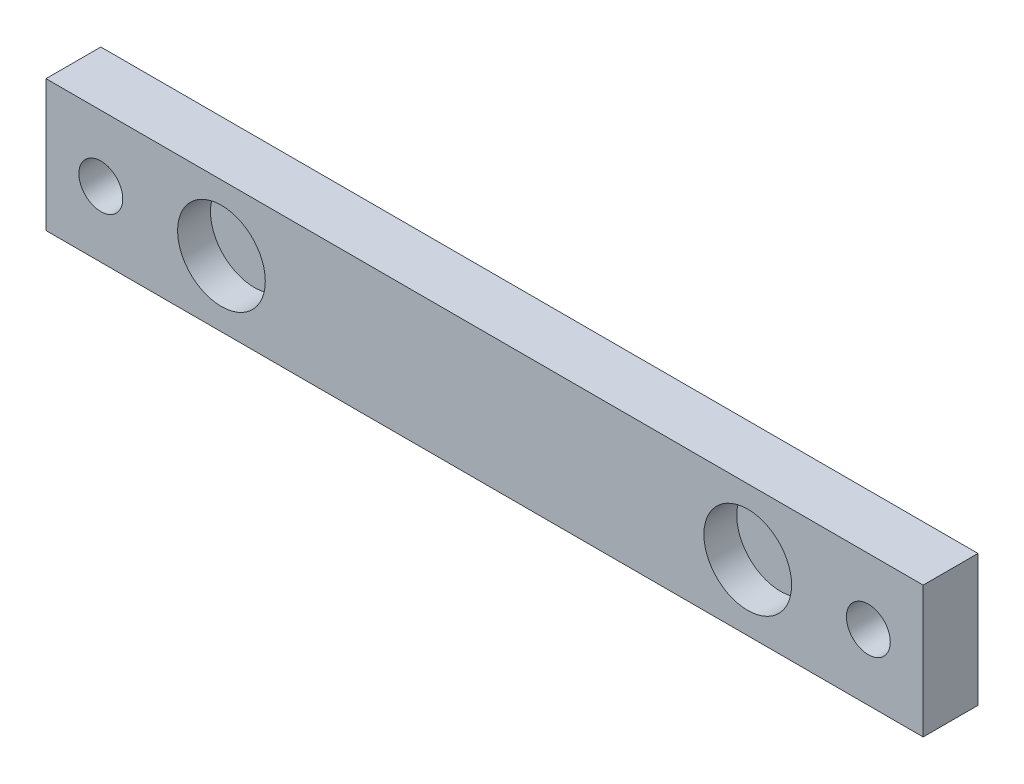
ISO-10303-21;
HEADER;
FILE_DESCRIPTION(('STEP AP214'),'2;1');
FILE_NAME('part.step','',(''),(''),'','','');
FILE_SCHEMA(('AUTOMOTIVE_DESIGN { 1 0 10303 214 1 1 1 1 }'));
ENDSEC;
DATA;
#1=APPLICATION_CONTEXT('core data for automotive mechanical design processes');
#2=APPLICATION_PROTOCOL_DEFINITION('international standard','automotive_design',2000,#1);
#3=PRODUCT_CONTEXT('',#1,'mechanical');
#4=PRODUCT('Part','Part','',(#3));
#5=PRODUCT_RELATED_PRODUCT_CATEGORY('part','',(#4));
#6=PRODUCT_DEFINITION_FORMATION('','',#4);
#7=PRODUCT_DEFINITION_CONTEXT('part definition',#1,'design');
#8=PRODUCT_DEFINITION('design','',#6,#7);
#9=PRODUCT_DEFINITION_SHAPE('','',#8);
#10=(LENGTH_UNIT() NAMED_UNIT(*) SI_UNIT(.MILLI.,.METRE.));
#11=(NAMED_UNIT(*) PLANE_ANGLE_UNIT() SI_UNIT($,.RADIAN.));
#12=(NAMED_UNIT(*) SI_UNIT($,.STERADIAN.) SOLID_ANGLE_UNIT());
#13=UNCERTAINTY_MEASURE_WITH_UNIT(LENGTH_MEASURE(1.E-05),#10,'distance_accuracy_value','');
#14=(GEOMETRIC_REPRESENTATION_CONTEXT(3) GLOBAL_UNCERTAINTY_ASSIGNED_CONTEXT((#13)) GLOBAL_UNIT_ASSIGNED_CONTEXT((#10,
#11,#12)) REPRESENTATION_CONTEXT('',''));
#15=CARTESIAN_POINT('',(0.,0.,0.));
#16=DIRECTION('',(0.,0.,1.));
#17=DIRECTION('',(1.,0.,0.));
#18=AXIS2_PLACEMENT_3D('',#15,#16,#17);
#19=CARTESIAN_POINT('',(14.,0.,5.));
#20=DIRECTION('',(0.,0.,-1.));
#21=DIRECTION('',(-1.,0.,0.));
#22=AXIS2_PLACEMENT_3D('',#19,#20,#21);
#23=CYLINDRICAL_SURFACE('',#22,4.);
#24=CARTESIAN_POINT('',(14.,0.,5.));
#25=DIRECTION('',(0.,0.,1.));
#26=DIRECTION('',(1.,0.,0.));
#27=AXIS2_PLACEMENT_3D('',#24,#25,#26);
#28=CIRCLE('',#27,4.);
#29=CARTESIAN_POINT('',(18.,0.,5.));
#30=VERTEX_POINT('',#29);
#31=EDGE_CURVE('E126',#30,#30,#28,.T.);
#32=ORIENTED_EDGE('',*,*,#31,.T.);
#33=EDGE_LOOP('',(#32));
#34=FACE_BOUND('',#33,.T.);
#35=CARTESIAN_POINT('',(14.,0.,2.));
#36=DIRECTION('',(0.,0.,-1.));
#37=DIRECTION('',(-1.,0.,0.));
#38=AXIS2_PLACEMENT_3D('',#35,#36,#37);
#39=CIRCLE('',#38,4.);
#40=CARTESIAN_POINT('',(10.,0.,2.));
#41=VERTEX_POINT('',#40);
#42=EDGE_CURVE('E132',#41,#41,#39,.T.);
#43=ORIENTED_EDGE('',*,*,#42,.T.);
#44=EDGE_LOOP('',(#43));
#45=FACE_BOUND('',#44,.T.);
#46=ADVANCED_FACE('F32',(#34,#45),#23,.F.);
#47=CARTESIAN_POINT('',(-34.,0.,5.));
#48=DIRECTION('',(0.,0.,-1.));
#49=DIRECTION('',(-1.,0.,0.));
#50=AXIS2_PLACEMENT_3D('',#47,#48,#49);
#51=CYLINDRICAL_SURFACE('',#50,3.99999999999999);
#52=CARTESIAN_POINT('',(-34.,0.,5.));
#53=DIRECTION('',(0.,0.,1.));
#54=DIRECTION('',(1.,0.,0.));
#55=AXIS2_PLACEMENT_3D('',#52,#53,#54);
#56=CIRCLE('',#55,3.99999999999999);
#57=CARTESIAN_POINT('',(-30.,0.,5.));
#58=VERTEX_POINT('',#57);
#59=EDGE_CURVE('E121',#58,#58,#56,.T.);
#60=ORIENTED_EDGE('',*,*,#59,.T.);
#61=EDGE_LOOP('',(#60));
#62=FACE_BOUND('',#61,.T.);
#63=CARTESIAN_POINT('',(-34.,0.,2.));
#64=DIRECTION('',(0.,0.,-1.));
#65=DIRECTION('',(-1.,0.,0.));
#66=AXIS2_PLACEMENT_3D('',#63,#64,#65);
#67=CIRCLE('',#66,4.);
#68=CARTESIAN_POINT('',(-38.,0.,2.));
#69=VERTEX_POINT('',#68);
#70=EDGE_CURVE('E129',#69,#69,#67,.T.);
#71=ORIENTED_EDGE('',*,*,#70,.T.);
#72=EDGE_LOOP('',(#71));
#73=FACE_BOUND('',#72,.T.);
#74=ADVANCED_FACE('F148',(#62,#73),#51,.F.);
#75=CARTESIAN_POINT('',(0.,0.,5.));
#76=DIRECTION('',(0.,0.,1.));
#77=DIRECTION('',(1.,0.,0.));
#78=AXIS2_PLACEMENT_3D('',#75,#76,#77);
#79=PLANE('',#78);
#80=ORIENTED_EDGE('',*,*,#59,.F.);
#81=EDGE_LOOP('',(#80));
#82=FACE_BOUND('',#81,.T.);
#83=CARTESIAN_POINT('',(-45.,0.,5.));
#84=DIRECTION('',(0.,0.,1.));
#85=DIRECTION('',(1.,0.,0.));
#86=AXIS2_PLACEMENT_3D('',#83,#84,#85);
#87=CIRCLE('',#86,2.);
#88=CARTESIAN_POINT('',(-43.,0.,5.));
#89=VERTEX_POINT('',#88);
#90=EDGE_CURVE('E100',#89,#89,#87,.T.);
#91=ORIENTED_EDGE('',*,*,#90,.F.);
#92=EDGE_LOOP('',(#91));
#93=FACE_BOUND('',#92,.T.);
#94=DIRECTION('',(-1.,0.,0.));
#95=VECTOR('',#94,1.);
#96=CARTESIAN_POINT('',(30.,6.,5.));
#97=LINE('',#96,#95);
#98=CARTESIAN_POINT('',(30.,6.,5.));
#99=VERTEX_POINT('',#98);
#100=CARTESIAN_POINT('',(-50.,5.99999999999999,5.));
#101=VERTEX_POINT('',#100);
#102=EDGE_CURVE('E85',#99,#101,#97,.T.);
#103=ORIENTED_EDGE('',*,*,#102,.T.);
#104=DIRECTION('',(0.,-1.,0.));
#105=VECTOR('',#104,1.);
#106=CARTESIAN_POINT('',(-50.,5.99999999999999,5.));
#107=LINE('',#106,#105);
#108=CARTESIAN_POINT('',(-50.,-6.00000000000001,5.));
#109=VERTEX_POINT('',#108);
#110=EDGE_CURVE('E79',#101,#109,#107,.T.);
#111=ORIENTED_EDGE('',*,*,#110,.T.);
#112=DIRECTION('',(1.,0.,0.));
#113=VECTOR('',#112,1.);
#114=CARTESIAN_POINT('',(-50.,-6.00000000000001,5.));
#115=LINE('',#114,#113);
#116=CARTESIAN_POINT('',(30.,-6.,5.));
#117=VERTEX_POINT('',#116);
#118=EDGE_CURVE('E83',#109,#117,#115,.T.);
#119=ORIENTED_EDGE('',*,*,#118,.T.);
#120=DIRECTION('',(0.,1.,0.));
#121=VECTOR('',#120,1.);
#122=CARTESIAN_POINT('',(30.,-6.,5.));
#123=LINE('',#122,#121);
#124=EDGE_CURVE('E49',#117,#99,#123,.T.);
#125=ORIENTED_EDGE('',*,*,#124,.T.);
#126=EDGE_LOOP('',(#103,#111,#119,#125));
#127=FACE_BOUND('',#126,.T.);
#128=CARTESIAN_POINT('',(25.,0.,5.));
#129=DIRECTION('',(0.,0.,1.));
#130=DIRECTION('',(1.,0.,0.));
#131=AXIS2_PLACEMENT_3D('',#128,#129,#130);
#132=CIRCLE('',#131,2.);
#133=CARTESIAN_POINT('',(27.,0.,5.));
#134=VERTEX_POINT('',#133);
#135=EDGE_CURVE('E115',#134,#134,#132,.T.);
#136=ORIENTED_EDGE('',*,*,#135,.F.);
#137=EDGE_LOOP('',(#136));
#138=FACE_BOUND('',#137,.T.);
#139=ORIENTED_EDGE('',*,*,#31,.F.);
#140=EDGE_LOOP('',(#139));
#141=FACE_BOUND('',#140,.T.);
#142=ADVANCED_FACE('F80',(#82,#93,#127,#138,#141),#79,.T.);
#143=CARTESIAN_POINT('',(0.,0.,0.));
#144=DIRECTION('',(0.,0.,1.));
#145=DIRECTION('',(1.,0.,0.));
#146=AXIS2_PLACEMENT_3D('',#143,#144,#145);
#147=PLANE('',#146);
#148=DIRECTION('',(-1.,0.,0.));
#149=VECTOR('',#148,1.);
#150=CARTESIAN_POINT('',(30.,6.,0.));
#151=LINE('',#150,#149);
#152=CARTESIAN_POINT('',(30.,6.,0.));
#153=VERTEX_POINT('',#152);
#154=CARTESIAN_POINT('',(-50.,5.99999999999999,0.));
#155=VERTEX_POINT('',#154);
#156=EDGE_CURVE('E97',#153,#155,#151,.T.);
#157=ORIENTED_EDGE('',*,*,#156,.F.);
#158=DIRECTION('',(0.,1.,0.));
#159=VECTOR('',#158,1.);
#160=CARTESIAN_POINT('',(30.,-6.,0.));
#161=LINE('',#160,#159);
#162=CARTESIAN_POINT('',(30.,-6.,0.));
#163=VERTEX_POINT('',#162);
#164=EDGE_CURVE('E72',#163,#153,#161,.T.);
#165=ORIENTED_EDGE('',*,*,#164,.F.);
#166=DIRECTION('',(1.,0.,0.));
#167=VECTOR('',#166,1.);
#168=CARTESIAN_POINT('',(-50.,-6.00000000000001,0.));
#169=LINE('',#168,#167);
#170=CARTESIAN_POINT('',(-50.,-6.00000000000001,0.));
#171=VERTEX_POINT('',#170);
#172=EDGE_CURVE('E66',#171,#163,#169,.T.);
#173=ORIENTED_EDGE('',*,*,#172,.F.);
#174=DIRECTION('',(0.,-1.,0.));
#175=VECTOR('',#174,1.);
#176=CARTESIAN_POINT('',(-50.,5.99999999999999,0.));
#177=LINE('',#176,#175);
#178=EDGE_CURVE('E89',#155,#171,#177,.T.);
#179=ORIENTED_EDGE('',*,*,#178,.F.);
#180=EDGE_LOOP('',(#157,#165,#173,#179));
#181=FACE_BOUND('',#180,.T.);
#182=CARTESIAN_POINT('',(-45.,0.,0.));
#183=DIRECTION('',(0.,0.,1.));
#184=DIRECTION('',(1.,0.,0.));
#185=AXIS2_PLACEMENT_3D('',#182,#183,#184);
#186=CIRCLE('',#185,2.);
#187=CARTESIAN_POINT('',(-43.,0.,0.));
#188=VERTEX_POINT('',#187);
#189=EDGE_CURVE('E112',#188,#188,#186,.T.);
#190=ORIENTED_EDGE('',*,*,#189,.T.);
#191=EDGE_LOOP('',(#190));
#192=FACE_BOUND('',#191,.T.);
#193=CARTESIAN_POINT('',(25.,0.,0.));
#194=DIRECTION('',(0.,0.,1.));
#195=DIRECTION('',(1.,0.,0.));
#196=AXIS2_PLACEMENT_3D('',#193,#194,#195);
#197=CIRCLE('',#196,2.);
#198=CARTESIAN_POINT('',(27.,0.,0.));
#199=VERTEX_POINT('',#198);
#200=EDGE_CURVE('E118',#199,#199,#197,.T.);
#201=ORIENTED_EDGE('',*,*,#200,.T.);
#202=EDGE_LOOP('',(#201));
#203=FACE_BOUND('',#202,.T.);
#204=ADVANCED_FACE('F108',(#181,#192,#203),#147,.F.);
#205=CARTESIAN_POINT('',(30.,6.,5.));
#206=DIRECTION('',(0.,-1.,0.));
#207=DIRECTION('',(1.,0.,0.));
#208=AXIS2_PLACEMENT_3D('',#205,#206,#207);
#209=PLANE('',#208);
#210=ORIENTED_EDGE('',*,*,#156,.T.);
#211=DIRECTION('',(0.,0.,-1.));
#212=VECTOR('',#211,1.);
#213=CARTESIAN_POINT('',(-50.,5.99999999999999,5.));
#214=LINE('',#213,#212);
#215=EDGE_CURVE('E11',#101,#155,#214,.T.);
#216=ORIENTED_EDGE('',*,*,#215,.F.);
#217=ORIENTED_EDGE('',*,*,#102,.F.);
#218=DIRECTION('',(0.,0.,-1.));
#219=VECTOR('',#218,1.);
#220=CARTESIAN_POINT('',(30.,6.,5.));
#221=LINE('',#220,#219);
#222=EDGE_CURVE('E93',#99,#153,#221,.T.);
#223=ORIENTED_EDGE('',*,*,#222,.T.);
#224=EDGE_LOOP('',(#210,#216,#217,#223));
#225=FACE_BOUND('',#224,.T.);
#226=ADVANCED_FACE('F34',(#225),#209,.F.);
#227=CARTESIAN_POINT('',(-50.,5.99999999999999,5.));
#228=DIRECTION('',(1.,0.,0.));
#229=DIRECTION('',(0.,0.,-1.));
#230=AXIS2_PLACEMENT_3D('',#227,#228,#229);
#231=PLANE('',#230);
#232=ORIENTED_EDGE('',*,*,#178,.T.);
#233=DIRECTION('',(0.,0.,-1.));
#234=VECTOR('',#233,1.);
#235=CARTESIAN_POINT('',(-50.,-6.00000000000001,5.));
#236=LINE('',#235,#234);
#237=EDGE_CURVE('E41',#109,#171,#236,.T.);
#238=ORIENTED_EDGE('',*,*,#237,.F.);
#239=ORIENTED_EDGE('',*,*,#110,.F.);
#240=ORIENTED_EDGE('',*,*,#215,.T.);
#241=EDGE_LOOP('',(#232,#238,#239,#240));
#242=FACE_BOUND('',#241,.T.);
#243=ADVANCED_FACE('F88',(#242),#231,.F.);
#244=CARTESIAN_POINT('',(-50.,-6.00000000000001,5.));
#245=DIRECTION('',(0.,1.,0.));
#246=DIRECTION('',(-1.,0.,0.));
#247=AXIS2_PLACEMENT_3D('',#244,#245,#246);
#248=PLANE('',#247);
#249=ORIENTED_EDGE('',*,*,#172,.T.);
#250=DIRECTION('',(0.,0.,-1.));
#251=VECTOR('',#250,1.);
#252=CARTESIAN_POINT('',(30.,-6.,5.));
#253=LINE('',#252,#251);
#254=EDGE_CURVE('E90',#117,#163,#253,.T.);
#255=ORIENTED_EDGE('',*,*,#254,.F.);
#256=ORIENTED_EDGE('',*,*,#118,.F.);
#257=ORIENTED_EDGE('',*,*,#237,.T.);
#258=EDGE_LOOP('',(#249,#255,#256,#257));
#259=FACE_BOUND('',#258,.T.);
#260=ADVANCED_FACE('F91',(#259),#248,.F.);
#261=CARTESIAN_POINT('',(30.,-6.,5.));
#262=DIRECTION('',(-1.,0.,0.));
#263=DIRECTION('',(0.,-1.,0.));
#264=AXIS2_PLACEMENT_3D('',#261,#262,#263);
#265=PLANE('',#264);
#266=ORIENTED_EDGE('',*,*,#164,.T.);
#267=ORIENTED_EDGE('',*,*,#222,.F.);
#268=ORIENTED_EDGE('',*,*,#124,.F.);
#269=ORIENTED_EDGE('',*,*,#254,.T.);
#270=EDGE_LOOP('',(#266,#267,#268,#269));
#271=FACE_BOUND('',#270,.T.);
#272=ADVANCED_FACE('F105',(#271),#265,.F.);
#273=CARTESIAN_POINT('',(-45.,0.,5.));
#274=DIRECTION('',(0.,0.,-1.));
#275=DIRECTION('',(-1.,0.,0.));
#276=AXIS2_PLACEMENT_3D('',#273,#274,#275);
#277=CYLINDRICAL_SURFACE('',#276,2.);
#278=ORIENTED_EDGE('',*,*,#90,.T.);
#279=EDGE_LOOP('',(#278));
#280=FACE_BOUND('',#279,.T.);
#281=ORIENTED_EDGE('',*,*,#189,.F.);
#282=EDGE_LOOP('',(#281));
#283=FACE_BOUND('',#282,.T.);
#284=ADVANCED_FACE('F159',(#280,#283),#277,.F.);
#285=CARTESIAN_POINT('',(25.,0.,5.));
#286=DIRECTION('',(0.,0.,-1.));
#287=DIRECTION('',(-1.,0.,0.));
#288=AXIS2_PLACEMENT_3D('',#285,#286,#287);
#289=CYLINDRICAL_SURFACE('',#288,2.);
#290=ORIENTED_EDGE('',*,*,#135,.T.);
#291=EDGE_LOOP('',(#290));
#292=FACE_BOUND('',#291,.T.);
#293=ORIENTED_EDGE('',*,*,#200,.F.);
#294=EDGE_LOOP('',(#293));
#295=FACE_BOUND('',#294,.T.);
#296=ADVANCED_FACE('F144',(#292,#295),#289,.F.);
#297=CARTESIAN_POINT('',(-34.,0.,2.));
#298=DIRECTION('',(0.,0.,-1.));
#299=DIRECTION('',(-1.,0.,0.));
#300=AXIS2_PLACEMENT_3D('',#297,#298,#299);
#301=PLANE('',#300);
#302=ORIENTED_EDGE('',*,*,#70,.F.);
#303=EDGE_LOOP('',(#302));
#304=FACE_BOUND('',#303,.T.);
#305=ADVANCED_FACE('F139',(#304),#301,.F.);
#306=CARTESIAN_POINT('',(14.,0.,2.));
#307=DIRECTION('',(0.,0.,-1.));
#308=DIRECTION('',(-1.,0.,0.));
#309=AXIS2_PLACEMENT_3D('',#306,#307,#308);
#310=PLANE('',#309);
#311=ORIENTED_EDGE('',*,*,#42,.F.);
#312=EDGE_LOOP('',(#311));
#313=FACE_BOUND('',#312,.T.);
#314=ADVANCED_FACE('F137',(#313),#310,.F.);
#315=CLOSED_SHELL('',(#46,#74,#142,#204,#226,#243,#260,#272,#284,#296,#305,#314));
#316=MANIFOLD_SOLID_BREP('B2',#315);
#317=ADVANCED_BREP_SHAPE_REPRESENTATION('',(#18,#316),#14);
#318=SHAPE_DEFINITION_REPRESENTATION(#9,#317);
ENDSEC;
END-ISO-10303-21;
